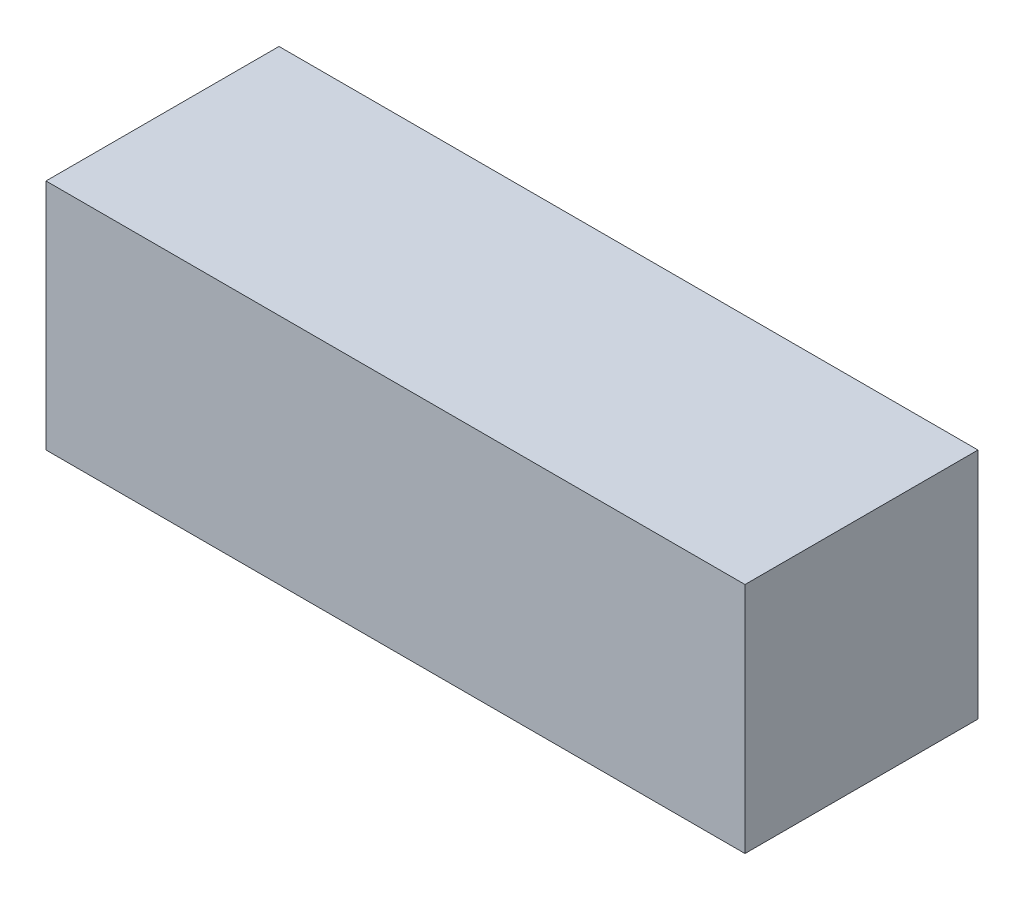
ISO-10303-21;
HEADER;
FILE_DESCRIPTION(('STEP AP214'),'2;1');
FILE_NAME('part.step','',(''),(''),'','','');
FILE_SCHEMA(('AUTOMOTIVE_DESIGN { 1 0 10303 214 1 1 1 1 }'));
ENDSEC;
DATA;
#1=APPLICATION_CONTEXT('core data for automotive mechanical design processes');
#2=APPLICATION_PROTOCOL_DEFINITION('international standard','automotive_design',2000,#1);
#3=PRODUCT_CONTEXT('',#1,'mechanical');
#4=PRODUCT('Part','Part','',(#3));
#5=PRODUCT_RELATED_PRODUCT_CATEGORY('part','',(#4));
#6=PRODUCT_DEFINITION_FORMATION('','',#4);
#7=PRODUCT_DEFINITION_CONTEXT('part definition',#1,'design');
#8=PRODUCT_DEFINITION('design','',#6,#7);
#9=PRODUCT_DEFINITION_SHAPE('','',#8);
#10=(LENGTH_UNIT() NAMED_UNIT(*) SI_UNIT(.MILLI.,.METRE.));
#11=(NAMED_UNIT(*) PLANE_ANGLE_UNIT() SI_UNIT($,.RADIAN.));
#12=(NAMED_UNIT(*) SI_UNIT($,.STERADIAN.) SOLID_ANGLE_UNIT());
#13=UNCERTAINTY_MEASURE_WITH_UNIT(LENGTH_MEASURE(1.E-05),#10,'distance_accuracy_value','');
#14=(GEOMETRIC_REPRESENTATION_CONTEXT(3) GLOBAL_UNCERTAINTY_ASSIGNED_CONTEXT((#13)) GLOBAL_UNIT_ASSIGNED_CONTEXT((#10,
#11,#12)) REPRESENTATION_CONTEXT('',''));
#15=CARTESIAN_POINT('',(0.,0.,0.));
#16=DIRECTION('',(0.,0.,1.));
#17=DIRECTION('',(1.,0.,0.));
#18=AXIS2_PLACEMENT_3D('',#15,#16,#17);
#19=CARTESIAN_POINT('',(0.,0.,100.));
#20=DIRECTION('',(1.,0.,0.));
#21=DIRECTION('',(0.,0.,-1.));
#22=AXIS2_PLACEMENT_3D('',#19,#20,#21);
#23=PLANE('',#22);
#24=DIRECTION('',(0.,-1.,0.));
#25=VECTOR('',#24,1.);
#26=CARTESIAN_POINT('',(0.,0.,0.));
#27=LINE('',#26,#25);
#28=CARTESIAN_POINT('',(0.,100.,0.));
#29=VERTEX_POINT('',#28);
#30=CARTESIAN_POINT('',(0.,0.,0.));
#31=VERTEX_POINT('',#30);
#32=EDGE_CURVE('E104',#29,#31,#27,.T.);
#33=ORIENTED_EDGE('',*,*,#32,.T.);
#34=DIRECTION('',(0.,0.,-1.));
#35=VECTOR('',#34,1.);
#36=CARTESIAN_POINT('',(0.,0.,100.));
#37=LINE('',#36,#35);
#38=CARTESIAN_POINT('',(0.,0.,100.));
#39=VERTEX_POINT('',#38);
#40=EDGE_CURVE('E11',#39,#31,#37,.T.);
#41=ORIENTED_EDGE('',*,*,#40,.F.);
#42=DIRECTION('',(0.,-1.,0.));
#43=VECTOR('',#42,1.);
#44=CARTESIAN_POINT('',(0.,0.,100.));
#45=LINE('',#44,#43);
#46=CARTESIAN_POINT('',(0.,100.,100.));
#47=VERTEX_POINT('',#46);
#48=EDGE_CURVE('E92',#47,#39,#45,.T.);
#49=ORIENTED_EDGE('',*,*,#48,.F.);
#50=DIRECTION('',(0.,0.,-1.));
#51=VECTOR('',#50,1.);
#52=CARTESIAN_POINT('',(0.,100.,100.));
#53=LINE('',#52,#51);
#54=EDGE_CURVE('E100',#47,#29,#53,.T.);
#55=ORIENTED_EDGE('',*,*,#54,.T.);
#56=EDGE_LOOP('',(#33,#41,#49,#55));
#57=FACE_BOUND('',#56,.T.);
#58=ADVANCED_FACE('F41',(#57),#23,.F.);
#59=CARTESIAN_POINT('',(0.,0.,100.));
#60=DIRECTION('',(0.,1.,0.));
#61=DIRECTION('',(0.,0.,1.));
#62=AXIS2_PLACEMENT_3D('',#59,#60,#61);
#63=PLANE('',#62);
#64=DIRECTION('',(1.,0.,0.));
#65=VECTOR('',#64,1.);
#66=CARTESIAN_POINT('',(0.,0.,0.));
#67=LINE('',#66,#65);
#68=CARTESIAN_POINT('',(300.,0.,0.));
#69=VERTEX_POINT('',#68);
#70=EDGE_CURVE('E96',#31,#69,#67,.T.);
#71=ORIENTED_EDGE('',*,*,#70,.T.);
#72=DIRECTION('',(0.,0.,-1.));
#73=VECTOR('',#72,1.);
#74=CARTESIAN_POINT('',(300.,0.,100.));
#75=LINE('',#74,#73);
#76=CARTESIAN_POINT('',(300.,0.,100.));
#77=VERTEX_POINT('',#76);
#78=EDGE_CURVE('E49',#77,#69,#75,.T.);
#79=ORIENTED_EDGE('',*,*,#78,.F.);
#80=DIRECTION('',(1.,0.,0.));
#81=VECTOR('',#80,1.);
#82=CARTESIAN_POINT('',(0.,0.,100.));
#83=LINE('',#82,#81);
#84=EDGE_CURVE('E87',#39,#77,#83,.T.);
#85=ORIENTED_EDGE('',*,*,#84,.F.);
#86=ORIENTED_EDGE('',*,*,#40,.T.);
#87=EDGE_LOOP('',(#71,#79,#85,#86));
#88=FACE_BOUND('',#87,.T.);
#89=ADVANCED_FACE('F95',(#88),#63,.F.);
#90=CARTESIAN_POINT('',(300.,0.,100.));
#91=DIRECTION('',(-1.,0.,0.));
#92=DIRECTION('',(0.,0.,1.));
#93=AXIS2_PLACEMENT_3D('',#90,#91,#92);
#94=PLANE('',#93);
#95=DIRECTION('',(0.,1.,0.));
#96=VECTOR('',#95,1.);
#97=CARTESIAN_POINT('',(300.,0.,0.));
#98=LINE('',#97,#96);
#99=CARTESIAN_POINT('',(300.,100.,0.));
#100=VERTEX_POINT('',#99);
#101=EDGE_CURVE('E74',#69,#100,#98,.T.);
#102=ORIENTED_EDGE('',*,*,#101,.T.);
#103=DIRECTION('',(0.,0.,-1.));
#104=VECTOR('',#103,1.);
#105=CARTESIAN_POINT('',(300.,100.,100.));
#106=LINE('',#105,#104);
#107=CARTESIAN_POINT('',(300.,100.,100.));
#108=VERTEX_POINT('',#107);
#109=EDGE_CURVE('E97',#108,#100,#106,.T.);
#110=ORIENTED_EDGE('',*,*,#109,.F.);
#111=DIRECTION('',(0.,1.,0.));
#112=VECTOR('',#111,1.);
#113=CARTESIAN_POINT('',(300.,0.,100.));
#114=LINE('',#113,#112);
#115=EDGE_CURVE('E90',#77,#108,#114,.T.);
#116=ORIENTED_EDGE('',*,*,#115,.F.);
#117=ORIENTED_EDGE('',*,*,#78,.T.);
#118=EDGE_LOOP('',(#102,#110,#116,#117));
#119=FACE_BOUND('',#118,.T.);
#120=ADVANCED_FACE('F98',(#119),#94,.F.);
#121=CARTESIAN_POINT('',(0.,100.,100.));
#122=DIRECTION('',(0.,-1.,0.));
#123=DIRECTION('',(0.,0.,-1.));
#124=AXIS2_PLACEMENT_3D('',#121,#122,#123);
#125=PLANE('',#124);
#126=DIRECTION('',(-1.,0.,0.));
#127=VECTOR('',#126,1.);
#128=CARTESIAN_POINT('',(0.,100.,0.));
#129=LINE('',#128,#127);
#130=EDGE_CURVE('E80',#100,#29,#129,.T.);
#131=ORIENTED_EDGE('',*,*,#130,.T.);
#132=ORIENTED_EDGE('',*,*,#54,.F.);
#133=DIRECTION('',(-1.,0.,0.));
#134=VECTOR('',#133,1.);
#135=CARTESIAN_POINT('',(0.,100.,100.));
#136=LINE('',#135,#134);
#137=EDGE_CURVE('E57',#108,#47,#136,.T.);
#138=ORIENTED_EDGE('',*,*,#137,.F.);
#139=ORIENTED_EDGE('',*,*,#109,.T.);
#140=EDGE_LOOP('',(#131,#132,#138,#139));
#141=FACE_BOUND('',#140,.T.);
#142=ADVANCED_FACE('F111',(#141),#125,.F.);
#143=CARTESIAN_POINT('',(0.,0.,100.));
#144=DIRECTION('',(0.,0.,-1.));
#145=DIRECTION('',(-1.,0.,0.));
#146=AXIS2_PLACEMENT_3D('',#143,#144,#145);
#147=PLANE('',#146);
#148=ORIENTED_EDGE('',*,*,#48,.T.);
#149=ORIENTED_EDGE('',*,*,#84,.T.);
#150=ORIENTED_EDGE('',*,*,#115,.T.);
#151=ORIENTED_EDGE('',*,*,#137,.T.);
#152=EDGE_LOOP('',(#148,#149,#150,#151));
#153=FACE_BOUND('',#152,.T.);
#154=ADVANCED_FACE('F88',(#153),#147,.F.);
#155=CARTESIAN_POINT('',(0.,0.,0.));
#156=DIRECTION('',(0.,0.,-1.));
#157=DIRECTION('',(-1.,0.,0.));
#158=AXIS2_PLACEMENT_3D('',#155,#156,#157);
#159=PLANE('',#158);
#160=ORIENTED_EDGE('',*,*,#32,.F.);
#161=ORIENTED_EDGE('',*,*,#130,.F.);
#162=ORIENTED_EDGE('',*,*,#101,.F.);
#163=ORIENTED_EDGE('',*,*,#70,.F.);
#164=EDGE_LOOP('',(#160,#161,#162,#163));
#165=FACE_BOUND('',#164,.T.);
#166=ADVANCED_FACE('F114',(#165),#159,.T.);
#167=CLOSED_SHELL('',(#58,#89,#120,#142,#154,#166));
#168=MANIFOLD_SOLID_BREP('B2',#167);
#169=ADVANCED_BREP_SHAPE_REPRESENTATION('',(#18,#168),#14);
#170=SHAPE_DEFINITION_REPRESENTATION(#9,#169);
ENDSEC;
END-ISO-10303-21;
